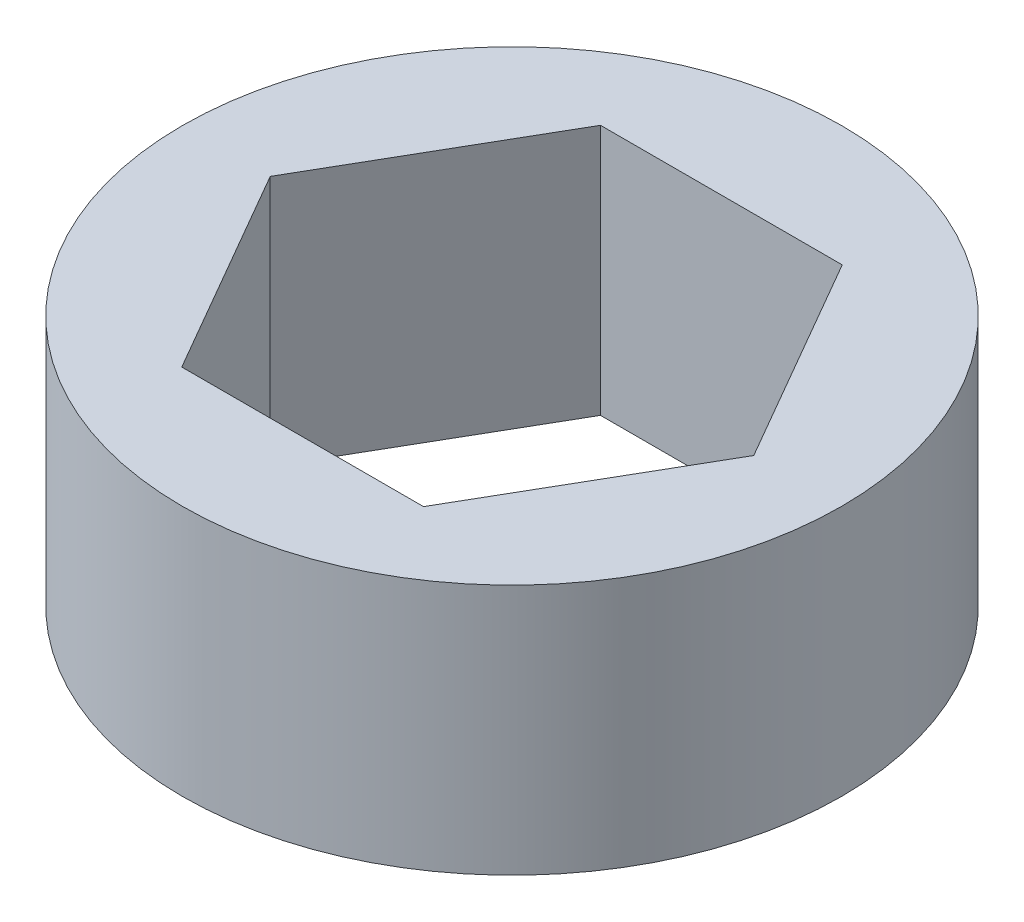
ISO-10303-21;
HEADER;
FILE_DESCRIPTION(('STEP AP214'),'2;1');
FILE_NAME('part.step','',(''),(''),'','','');
FILE_SCHEMA(('AUTOMOTIVE_DESIGN { 1 0 10303 214 1 1 1 1 }'));
ENDSEC;
DATA;
#1=APPLICATION_CONTEXT('core data for automotive mechanical design processes');
#2=APPLICATION_PROTOCOL_DEFINITION('international standard','automotive_design',2000,#1);
#3=PRODUCT_CONTEXT('',#1,'mechanical');
#4=PRODUCT('Part','Part','',(#3));
#5=PRODUCT_RELATED_PRODUCT_CATEGORY('part','',(#4));
#6=PRODUCT_DEFINITION_FORMATION('','',#4);
#7=PRODUCT_DEFINITION_CONTEXT('part definition',#1,'design');
#8=PRODUCT_DEFINITION('design','',#6,#7);
#9=PRODUCT_DEFINITION_SHAPE('','',#8);
#10=(LENGTH_UNIT() NAMED_UNIT(*) SI_UNIT(.MILLI.,.METRE.));
#11=(NAMED_UNIT(*) PLANE_ANGLE_UNIT() SI_UNIT($,.RADIAN.));
#12=(NAMED_UNIT(*) SI_UNIT($,.STERADIAN.) SOLID_ANGLE_UNIT());
#13=UNCERTAINTY_MEASURE_WITH_UNIT(LENGTH_MEASURE(1.E-05),#10,'distance_accuracy_value','');
#14=(GEOMETRIC_REPRESENTATION_CONTEXT(3) GLOBAL_UNCERTAINTY_ASSIGNED_CONTEXT((#13)) GLOBAL_UNIT_ASSIGNED_CONTEXT((#10,
#11,#12)) REPRESENTATION_CONTEXT('',''));
#15=CARTESIAN_POINT('',(0.,0.,0.));
#16=DIRECTION('',(0.,0.,1.));
#17=DIRECTION('',(1.,0.,0.));
#18=AXIS2_PLACEMENT_3D('',#15,#16,#17);
#19=CARTESIAN_POINT('',(0.,7.62,0.));
#20=DIRECTION('',(0.,1.,0.));
#21=DIRECTION('',(0.,0.,1.));
#22=AXIS2_PLACEMENT_3D('',#19,#20,#21);
#23=PLANE('',#22);
#24=CARTESIAN_POINT('',(0.,7.62,0.));
#25=DIRECTION('',(0.,1.,0.));
#26=DIRECTION('',(0.,0.,1.));
#27=AXIS2_PLACEMENT_3D('',#24,#25,#26);
#28=CIRCLE('',#27,10.);
#29=CARTESIAN_POINT('',(0.,7.62,-10.));
#30=VERTEX_POINT('',#29);
#31=EDGE_CURVE('E11',#30,#30,#28,.T.);
#32=ORIENTED_EDGE('',*,*,#31,.T.);
#33=EDGE_LOOP('',(#32));
#34=FACE_BOUND('',#33,.T.);
#35=DIRECTION('',(0.5,0.,0.866025403784439));
#36=VECTOR('',#35,1.);
#37=CARTESIAN_POINT('',(-7.33234841870825,7.62,0.));
#38=LINE('',#37,#36);
#39=CARTESIAN_POINT('',(-7.33234841870825,7.62,0.));
#40=VERTEX_POINT('',#39);
#41=CARTESIAN_POINT('',(-3.66617420935413,7.62,6.35));
#42=VERTEX_POINT('',#41);
#43=EDGE_CURVE('E94',#40,#42,#38,.T.);
#44=ORIENTED_EDGE('',*,*,#43,.F.);
#45=DIRECTION('',(-0.5,0.,0.866025403784439));
#46=VECTOR('',#45,1.);
#47=CARTESIAN_POINT('',(-3.66617420935412,7.62,-6.35));
#48=LINE('',#47,#46);
#49=CARTESIAN_POINT('',(-3.66617420935412,7.62,-6.35));
#50=VERTEX_POINT('',#49);
#51=EDGE_CURVE('E86',#50,#40,#48,.T.);
#52=ORIENTED_EDGE('',*,*,#51,.F.);
#53=DIRECTION('',(-1.,0.,0.));
#54=VECTOR('',#53,1.);
#55=CARTESIAN_POINT('',(3.66617420935412,7.62,-6.35));
#56=LINE('',#55,#54);
#57=CARTESIAN_POINT('',(3.66617420935412,7.62,-6.35));
#58=VERTEX_POINT('',#57);
#59=EDGE_CURVE('E114',#58,#50,#56,.T.);
#60=ORIENTED_EDGE('',*,*,#59,.F.);
#61=DIRECTION('',(-0.5,0.,-0.866025403784439));
#62=VECTOR('',#61,1.);
#63=CARTESIAN_POINT('',(7.33234841870825,7.62,0.));
#64=LINE('',#63,#62);
#65=CARTESIAN_POINT('',(7.33234841870825,7.62,0.));
#66=VERTEX_POINT('',#65);
#67=EDGE_CURVE('E112',#66,#58,#64,.T.);
#68=ORIENTED_EDGE('',*,*,#67,.F.);
#69=DIRECTION('',(0.5,0.,-0.866025403784439));
#70=VECTOR('',#69,1.);
#71=CARTESIAN_POINT('',(3.66617420935412,7.62,6.35));
#72=LINE('',#71,#70);
#73=CARTESIAN_POINT('',(3.66617420935412,7.62,6.35));
#74=VERTEX_POINT('',#73);
#75=EDGE_CURVE('E108',#74,#66,#72,.T.);
#76=ORIENTED_EDGE('',*,*,#75,.F.);
#77=DIRECTION('',(1.,0.,0.));
#78=VECTOR('',#77,1.);
#79=CARTESIAN_POINT('',(-3.66617420935413,7.62,6.35));
#80=LINE('',#79,#78);
#81=EDGE_CURVE('E106',#42,#74,#80,.T.);
#82=ORIENTED_EDGE('',*,*,#81,.F.);
#83=EDGE_LOOP('',(#44,#52,#60,#68,#76,#82));
#84=FACE_BOUND('',#83,.T.);
#85=ADVANCED_FACE('F33',(#34,#84),#23,.T.);
#86=CARTESIAN_POINT('',(0.,0.,0.));
#87=DIRECTION('',(0.,1.,0.));
#88=DIRECTION('',(0.,0.,1.));
#89=AXIS2_PLACEMENT_3D('',#86,#87,#88);
#90=PLANE('',#89);
#91=CARTESIAN_POINT('',(0.,0.,0.));
#92=DIRECTION('',(0.,1.,0.));
#93=DIRECTION('',(0.,0.,1.));
#94=AXIS2_PLACEMENT_3D('',#91,#92,#93);
#95=CIRCLE('',#94,10.);
#96=CARTESIAN_POINT('',(0.,0.,-10.));
#97=VERTEX_POINT('',#96);
#98=EDGE_CURVE('E37',#97,#97,#95,.T.);
#99=ORIENTED_EDGE('',*,*,#98,.F.);
#100=EDGE_LOOP('',(#99));
#101=FACE_BOUND('',#100,.T.);
#102=DIRECTION('',(-0.5,0.,0.866025403784439));
#103=VECTOR('',#102,1.);
#104=CARTESIAN_POINT('',(-3.66617420935412,0.,-6.35));
#105=LINE('',#104,#103);
#106=CARTESIAN_POINT('',(-3.66617420935412,0.,-6.35));
#107=VERTEX_POINT('',#106);
#108=CARTESIAN_POINT('',(-7.33234841870825,0.,0.));
#109=VERTEX_POINT('',#108);
#110=EDGE_CURVE('E56',#107,#109,#105,.T.);
#111=ORIENTED_EDGE('',*,*,#110,.T.);
#112=DIRECTION('',(0.5,0.,0.866025403784439));
#113=VECTOR('',#112,1.);
#114=CARTESIAN_POINT('',(-7.33234841870825,0.,0.));
#115=LINE('',#114,#113);
#116=CARTESIAN_POINT('',(-3.66617420935413,0.,6.35));
#117=VERTEX_POINT('',#116);
#118=EDGE_CURVE('E101',#109,#117,#115,.T.);
#119=ORIENTED_EDGE('',*,*,#118,.T.);
#120=DIRECTION('',(1.,0.,0.));
#121=VECTOR('',#120,1.);
#122=CARTESIAN_POINT('',(-3.66617420935413,0.,6.35));
#123=LINE('',#122,#121);
#124=CARTESIAN_POINT('',(3.66617420935412,0.,6.35));
#125=VERTEX_POINT('',#124);
#126=EDGE_CURVE('E118',#117,#125,#123,.T.);
#127=ORIENTED_EDGE('',*,*,#126,.T.);
#128=DIRECTION('',(0.5,0.,-0.866025403784439));
#129=VECTOR('',#128,1.);
#130=CARTESIAN_POINT('',(3.66617420935412,0.,6.35));
#131=LINE('',#130,#129);
#132=CARTESIAN_POINT('',(7.33234841870825,0.,0.));
#133=VERTEX_POINT('',#132);
#134=EDGE_CURVE('E121',#125,#133,#131,.T.);
#135=ORIENTED_EDGE('',*,*,#134,.T.);
#136=DIRECTION('',(-0.5,0.,-0.866025403784439));
#137=VECTOR('',#136,1.);
#138=CARTESIAN_POINT('',(7.33234841870825,0.,0.));
#139=LINE('',#138,#137);
#140=CARTESIAN_POINT('',(3.66617420935412,0.,-6.35));
#141=VERTEX_POINT('',#140);
#142=EDGE_CURVE('E124',#133,#141,#139,.T.);
#143=ORIENTED_EDGE('',*,*,#142,.T.);
#144=DIRECTION('',(-1.,0.,0.));
#145=VECTOR('',#144,1.);
#146=CARTESIAN_POINT('',(3.66617420935412,0.,-6.35));
#147=LINE('',#146,#145);
#148=EDGE_CURVE('E95',#141,#107,#147,.T.);
#149=ORIENTED_EDGE('',*,*,#148,.T.);
#150=EDGE_LOOP('',(#111,#119,#127,#135,#143,#149));
#151=FACE_BOUND('',#150,.T.);
#152=ADVANCED_FACE('F141',(#101,#151),#90,.F.);
#153=CARTESIAN_POINT('',(0.,7.62,0.));
#154=DIRECTION('',(0.,-1.,0.));
#155=DIRECTION('',(0.,0.,-1.));
#156=AXIS2_PLACEMENT_3D('',#153,#154,#155);
#157=CYLINDRICAL_SURFACE('',#156,10.);
#158=CARTESIAN_POINT('',(0.,7.62,-10.));
#159=CARTESIAN_POINT('',(0.,7.540625,-10.));
#160=CARTESIAN_POINT('',(0.,7.46125,-10.));
#161=CARTESIAN_POINT('',(0.,7.3025,-10.));
#162=CARTESIAN_POINT('',(0.,7.223125,-10.));
#163=CARTESIAN_POINT('',(0.,7.064375,-10.));
#164=CARTESIAN_POINT('',(0.,6.985,-10.));
#165=CARTESIAN_POINT('',(0.,6.82625,-10.));
#166=CARTESIAN_POINT('',(0.,6.746875,-10.));
#167=CARTESIAN_POINT('',(0.,6.588125,-10.));
#168=CARTESIAN_POINT('',(0.,6.50875,-10.));
#169=CARTESIAN_POINT('',(0.,6.35,-10.));
#170=CARTESIAN_POINT('',(0.,6.270625,-10.));
#171=CARTESIAN_POINT('',(0.,6.111875,-10.));
#172=CARTESIAN_POINT('',(0.,6.0325,-10.));
#173=CARTESIAN_POINT('',(0.,5.87375,-10.));
#174=CARTESIAN_POINT('',(0.,5.794375,-10.));
#175=CARTESIAN_POINT('',(0.,5.635625,-10.));
#176=CARTESIAN_POINT('',(0.,5.55625,-10.));
#177=CARTESIAN_POINT('',(0.,5.3975,-10.));
#178=CARTESIAN_POINT('',(0.,5.318125,-10.));
#179=CARTESIAN_POINT('',(0.,5.159375,-10.));
#180=CARTESIAN_POINT('',(0.,5.08,-10.));
#181=CARTESIAN_POINT('',(0.,4.92125,-10.));
#182=CARTESIAN_POINT('',(0.,4.841875,-10.));
#183=CARTESIAN_POINT('',(0.,4.683125,-10.));
#184=CARTESIAN_POINT('',(0.,4.60375,-10.));
#185=CARTESIAN_POINT('',(0.,4.445,-10.));
#186=CARTESIAN_POINT('',(0.,4.365625,-10.));
#187=CARTESIAN_POINT('',(0.,4.206875,-10.));
#188=CARTESIAN_POINT('',(0.,4.1275,-10.));
#189=CARTESIAN_POINT('',(0.,3.96875,-10.));
#190=CARTESIAN_POINT('',(0.,3.889375,-10.));
#191=CARTESIAN_POINT('',(0.,3.730625,-10.));
#192=CARTESIAN_POINT('',(0.,3.65125,-10.));
#193=CARTESIAN_POINT('',(0.,3.4925,-10.));
#194=CARTESIAN_POINT('',(0.,3.413125,-10.));
#195=CARTESIAN_POINT('',(0.,3.254375,-10.));
#196=CARTESIAN_POINT('',(0.,3.175,-10.));
#197=CARTESIAN_POINT('',(0.,3.01625,-10.));
#198=CARTESIAN_POINT('',(0.,2.936875,-10.));
#199=CARTESIAN_POINT('',(0.,2.778125,-10.));
#200=CARTESIAN_POINT('',(0.,2.69875,-10.));
#201=CARTESIAN_POINT('',(0.,2.54,-10.));
#202=CARTESIAN_POINT('',(0.,2.460625,-10.));
#203=CARTESIAN_POINT('',(0.,2.301875,-10.));
#204=CARTESIAN_POINT('',(0.,2.2225,-10.));
#205=CARTESIAN_POINT('',(0.,2.06375,-10.));
#206=CARTESIAN_POINT('',(0.,1.984375,-10.));
#207=CARTESIAN_POINT('',(0.,1.825625,-10.));
#208=CARTESIAN_POINT('',(0.,1.74625,-10.));
#209=CARTESIAN_POINT('',(0.,1.5875,-10.));
#210=CARTESIAN_POINT('',(0.,1.508125,-10.));
#211=CARTESIAN_POINT('',(0.,1.349375,-10.));
#212=CARTESIAN_POINT('',(0.,1.27,-10.));
#213=CARTESIAN_POINT('',(0.,1.11125,-10.));
#214=CARTESIAN_POINT('',(0.,1.031875,-10.));
#215=CARTESIAN_POINT('',(0.,0.873125,-10.));
#216=CARTESIAN_POINT('',(0.,0.79375,-10.));
#217=CARTESIAN_POINT('',(0.,0.635,-10.));
#218=CARTESIAN_POINT('',(0.,0.555625,-10.));
#219=CARTESIAN_POINT('',(0.,0.396875,-10.));
#220=CARTESIAN_POINT('',(0.,0.3175,-10.));
#221=CARTESIAN_POINT('',(0.,0.15875,-10.));
#222=CARTESIAN_POINT('',(0.,0.0793749999999999,-10.));
#223=CARTESIAN_POINT('',(0.,0.,-10.));
#224=B_SPLINE_CURVE_WITH_KNOTS('',3,(#158,#159,#160,#161,#162,#163,#164,#165,#166,#167,#168,
#169,#170,#171,#172,#173,#174,#175,#176,#177,#178,#179,#180,#181,#182,#183,#184,#185,#186,#187,
#188,#189,#190,#191,#192,#193,#194,#195,#196,#197,#198,#199,#200,#201,#202,#203,#204,#205,#206,
#207,#208,#209,#210,#211,#212,#213,#214,#215,#216,#217,#218,#219,#220,#221,#222,#223),
.UNSPECIFIED.,.F.,.F.,(4,2,2,2,2,2,2,2,2,2,2,2,2,2,2,2,2,2,2,2,2,2,2,2,2,2,2,2,2,2,2,2,4),(0.,
0.238125,0.476249999999999,0.714375,0.952499999999999,1.190625,1.42875,1.666875,1.905,2.143125,
2.38125,2.619375,2.8575,3.095625,3.33375,3.571875,3.81,4.048125,4.28625,4.524375,4.7625,
5.000625,5.23875,5.476875,5.715,5.953125,6.19125,6.429375,6.6675,6.905625,7.14375,7.381875,
7.62),.UNSPECIFIED.);
#225=EDGE_CURVE('BSEAM35',#30,#97,#224,.T.);
#226=ORIENTED_EDGE('',*,*,#31,.F.);
#227=ORIENTED_EDGE('',*,*,#98,.T.);
#228=ORIENTED_EDGE('',*,*,#225,.T.);
#229=ORIENTED_EDGE('',*,*,#225,.F.);
#230=EDGE_LOOP('',(#226,#228,#227,#229));
#231=FACE_BOUND('',#230,.T.);
#232=ADVANCED_FACE('F35',(#231),#157,.T.);
#233=CARTESIAN_POINT('',(-3.66617420935412,7.62,-6.35));
#234=DIRECTION('',(0.866025403784439,0.,0.5));
#235=DIRECTION('',(0.5,0.,-0.866025403784439));
#236=AXIS2_PLACEMENT_3D('',#233,#234,#235);
#237=PLANE('',#236);
#238=ORIENTED_EDGE('',*,*,#110,.F.);
#239=DIRECTION('',(0.,-1.,0.));
#240=VECTOR('',#239,1.);
#241=CARTESIAN_POINT('',(-3.66617420935412,7.62,-6.35));
#242=LINE('',#241,#240);
#243=EDGE_CURVE('E90',#50,#107,#242,.T.);
#244=ORIENTED_EDGE('',*,*,#243,.F.);
#245=ORIENTED_EDGE('',*,*,#51,.T.);
#246=DIRECTION('',(0.,-1.,0.));
#247=VECTOR('',#246,1.);
#248=CARTESIAN_POINT('',(-7.33234841870825,7.62,0.));
#249=LINE('',#248,#247);
#250=EDGE_CURVE('E89',#40,#109,#249,.T.);
#251=ORIENTED_EDGE('',*,*,#250,.T.);
#252=EDGE_LOOP('',(#238,#244,#245,#251));
#253=FACE_BOUND('',#252,.T.);
#254=ADVANCED_FACE('F88',(#253),#237,.T.);
#255=CARTESIAN_POINT('',(-7.33234841870825,7.62,0.));
#256=DIRECTION('',(0.866025403784439,0.,-0.5));
#257=DIRECTION('',(-0.5,0.,-0.866025403784439));
#258=AXIS2_PLACEMENT_3D('',#255,#256,#257);
#259=PLANE('',#258);
#260=ORIENTED_EDGE('',*,*,#118,.F.);
#261=ORIENTED_EDGE('',*,*,#250,.F.);
#262=ORIENTED_EDGE('',*,*,#43,.T.);
#263=DIRECTION('',(0.,-1.,0.));
#264=VECTOR('',#263,1.);
#265=CARTESIAN_POINT('',(-3.66617420935413,7.62,6.35));
#266=LINE('',#265,#264);
#267=EDGE_CURVE('E102',#42,#117,#266,.T.);
#268=ORIENTED_EDGE('',*,*,#267,.T.);
#269=EDGE_LOOP('',(#260,#261,#262,#268));
#270=FACE_BOUND('',#269,.T.);
#271=ADVANCED_FACE('F98',(#270),#259,.T.);
#272=CARTESIAN_POINT('',(-3.66617420935413,7.62,6.35));
#273=DIRECTION('',(0.,0.,-1.));
#274=DIRECTION('',(-1.,0.,0.));
#275=AXIS2_PLACEMENT_3D('',#272,#273,#274);
#276=PLANE('',#275);
#277=ORIENTED_EDGE('',*,*,#126,.F.);
#278=ORIENTED_EDGE('',*,*,#267,.F.);
#279=ORIENTED_EDGE('',*,*,#81,.T.);
#280=DIRECTION('',(0.,-1.,0.));
#281=VECTOR('',#280,1.);
#282=CARTESIAN_POINT('',(3.66617420935412,7.62,6.35));
#283=LINE('',#282,#281);
#284=EDGE_CURVE('E133',#74,#125,#283,.T.);
#285=ORIENTED_EDGE('',*,*,#284,.T.);
#286=EDGE_LOOP('',(#277,#278,#279,#285));
#287=FACE_BOUND('',#286,.T.);
#288=ADVANCED_FACE('F137',(#287),#276,.T.);
#289=CARTESIAN_POINT('',(3.66617420935412,7.62,6.35));
#290=DIRECTION('',(-0.866025403784439,0.,-0.5));
#291=DIRECTION('',(-0.5,0.,0.866025403784439));
#292=AXIS2_PLACEMENT_3D('',#289,#290,#291);
#293=PLANE('',#292);
#294=ORIENTED_EDGE('',*,*,#134,.F.);
#295=ORIENTED_EDGE('',*,*,#284,.F.);
#296=ORIENTED_EDGE('',*,*,#75,.T.);
#297=DIRECTION('',(0.,-1.,0.));
#298=VECTOR('',#297,1.);
#299=CARTESIAN_POINT('',(7.33234841870825,7.62,0.));
#300=LINE('',#299,#298);
#301=EDGE_CURVE('E131',#66,#133,#300,.T.);
#302=ORIENTED_EDGE('',*,*,#301,.T.);
#303=EDGE_LOOP('',(#294,#295,#296,#302));
#304=FACE_BOUND('',#303,.T.);
#305=ADVANCED_FACE('F149',(#304),#293,.T.);
#306=CARTESIAN_POINT('',(7.33234841870825,7.62,0.));
#307=DIRECTION('',(-0.866025403784439,0.,0.5));
#308=DIRECTION('',(0.5,0.,0.866025403784439));
#309=AXIS2_PLACEMENT_3D('',#306,#307,#308);
#310=PLANE('',#309);
#311=ORIENTED_EDGE('',*,*,#142,.F.);
#312=ORIENTED_EDGE('',*,*,#301,.F.);
#313=ORIENTED_EDGE('',*,*,#67,.T.);
#314=DIRECTION('',(0.,-1.,0.));
#315=VECTOR('',#314,1.);
#316=CARTESIAN_POINT('',(3.66617420935412,7.62,-6.35));
#317=LINE('',#316,#315);
#318=EDGE_CURVE('E48',#58,#141,#317,.T.);
#319=ORIENTED_EDGE('',*,*,#318,.T.);
#320=EDGE_LOOP('',(#311,#312,#313,#319));
#321=FACE_BOUND('',#320,.T.);
#322=ADVANCED_FACE('F147',(#321),#310,.T.);
#323=CARTESIAN_POINT('',(3.66617420935412,7.62,-6.35));
#324=DIRECTION('',(0.,0.,1.));
#325=DIRECTION('',(1.,0.,0.));
#326=AXIS2_PLACEMENT_3D('',#323,#324,#325);
#327=PLANE('',#326);
#328=ORIENTED_EDGE('',*,*,#148,.F.);
#329=ORIENTED_EDGE('',*,*,#318,.F.);
#330=ORIENTED_EDGE('',*,*,#59,.T.);
#331=ORIENTED_EDGE('',*,*,#243,.T.);
#332=EDGE_LOOP('',(#328,#329,#330,#331));
#333=FACE_BOUND('',#332,.T.);
#334=ADVANCED_FACE('F143',(#333),#327,.T.);
#335=CLOSED_SHELL('',(#85,#152,#232,#254,#271,#288,#305,#322,#334));
#336=MANIFOLD_SOLID_BREP('B2',#335);
#337=ADVANCED_BREP_SHAPE_REPRESENTATION('',(#18,#336),#14);
#338=SHAPE_DEFINITION_REPRESENTATION(#9,#337);
ENDSEC;
END-ISO-10303-21;
